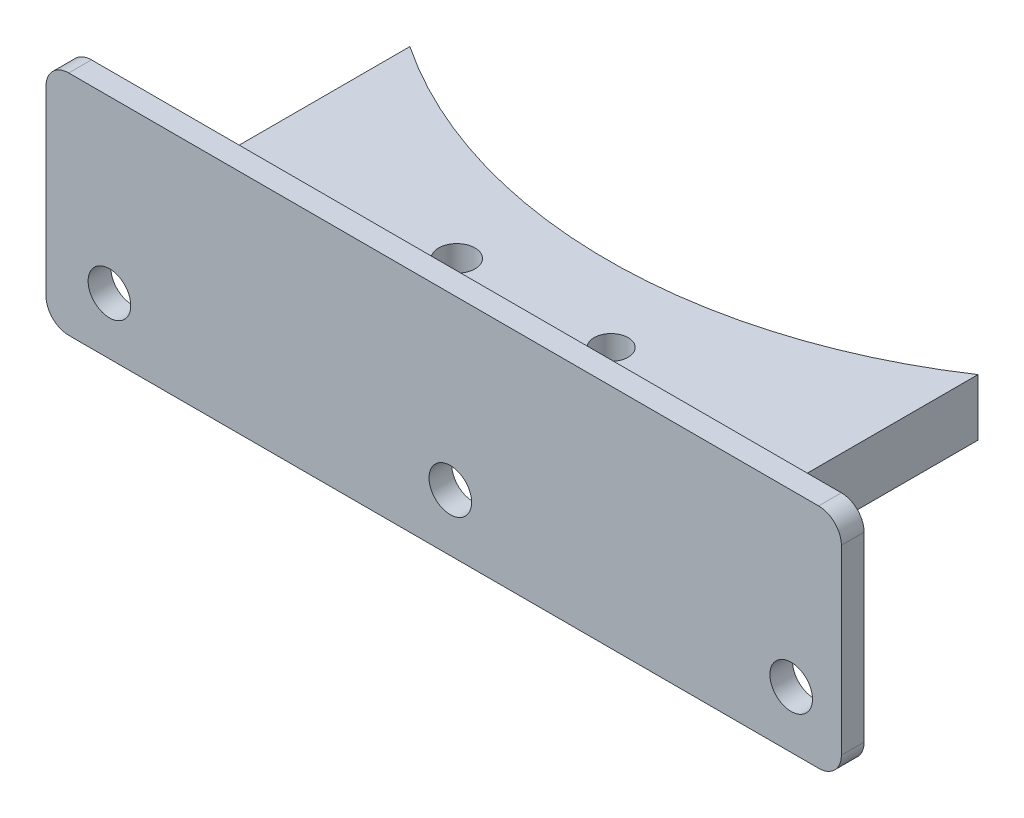
ISO-10303-21;
HEADER;
FILE_DESCRIPTION(('STEP AP214'),'2;1');
FILE_NAME('part.step','',(''),(''),'','','');
FILE_SCHEMA(('AUTOMOTIVE_DESIGN { 1 0 10303 214 1 1 1 1 }'));
ENDSEC;
DATA;
#1=APPLICATION_CONTEXT('core data for automotive mechanical design processes');
#2=APPLICATION_PROTOCOL_DEFINITION('international standard','automotive_design',2000,#1);
#3=PRODUCT_CONTEXT('',#1,'mechanical');
#4=PRODUCT('Part','Part','',(#3));
#5=PRODUCT_RELATED_PRODUCT_CATEGORY('part','',(#4));
#6=PRODUCT_DEFINITION_FORMATION('','',#4);
#7=PRODUCT_DEFINITION_CONTEXT('part definition',#1,'design');
#8=PRODUCT_DEFINITION('design','',#6,#7);
#9=PRODUCT_DEFINITION_SHAPE('','',#8);
#10=(LENGTH_UNIT() NAMED_UNIT(*) SI_UNIT(.MILLI.,.METRE.));
#11=(NAMED_UNIT(*) PLANE_ANGLE_UNIT() SI_UNIT($,.RADIAN.));
#12=(NAMED_UNIT(*) SI_UNIT($,.STERADIAN.) SOLID_ANGLE_UNIT());
#13=UNCERTAINTY_MEASURE_WITH_UNIT(LENGTH_MEASURE(1.E-05),#10,'distance_accuracy_value','');
#14=(GEOMETRIC_REPRESENTATION_CONTEXT(3) GLOBAL_UNCERTAINTY_ASSIGNED_CONTEXT((#13)) GLOBAL_UNIT_ASSIGNED_CONTEXT((#10,
#11,#12)) REPRESENTATION_CONTEXT('',''));
#15=CARTESIAN_POINT('',(0.,0.,0.));
#16=DIRECTION('',(0.,0.,1.));
#17=DIRECTION('',(1.,0.,0.));
#18=AXIS2_PLACEMENT_3D('',#15,#16,#17);
#19=CARTESIAN_POINT('',(0.,0.,0.));
#20=DIRECTION('',(0.,0.,-1.));
#21=DIRECTION('',(-1.,0.,0.));
#22=AXIS2_PLACEMENT_3D('',#19,#20,#21);
#23=PLANE('',#22);
#24=CARTESIAN_POINT('',(38.8383997376137,-6.35,0.));
#25=DIRECTION('',(0.,0.,-1.));
#26=DIRECTION('',(-1.,0.,0.));
#27=AXIS2_PLACEMENT_3D('',#24,#25,#26);
#28=CIRCLE('',#27,2.38125);
#29=CARTESIAN_POINT('',(36.4571497376137,-6.35,0.));
#30=VERTEX_POINT('',#29);
#31=EDGE_CURVE('E451',#30,#30,#28,.T.);
#32=ORIENTED_EDGE('',*,*,#31,.F.);
#33=EDGE_LOOP('',(#32));
#34=FACE_BOUND('',#33,.T.);
#35=CARTESIAN_POINT('',(0.738399737613658,-6.35,0.));
#36=DIRECTION('',(0.,0.,-1.));
#37=DIRECTION('',(-1.,0.,0.));
#38=AXIS2_PLACEMENT_3D('',#35,#36,#37);
#39=CIRCLE('',#38,2.38125);
#40=CARTESIAN_POINT('',(-1.64285026238634,-6.35,0.));
#41=VERTEX_POINT('',#40);
#42=EDGE_CURVE('E312',#41,#41,#39,.T.);
#43=ORIENTED_EDGE('',*,*,#42,.F.);
#44=EDGE_LOOP('',(#43));
#45=FACE_BOUND('',#44,.T.);
#46=CARTESIAN_POINT('',(-37.3616002623863,-6.35,0.));
#47=DIRECTION('',(0.,0.,-1.));
#48=DIRECTION('',(-1.,0.,0.));
#49=AXIS2_PLACEMENT_3D('',#46,#47,#48);
#50=CIRCLE('',#49,2.38125);
#51=CARTESIAN_POINT('',(-39.7428502623863,-6.35,0.));
#52=VERTEX_POINT('',#51);
#53=EDGE_CURVE('E300',#52,#52,#50,.T.);
#54=ORIENTED_EDGE('',*,*,#53,.F.);
#55=EDGE_LOOP('',(#54));
#56=FACE_BOUND('',#55,.T.);
#57=DIRECTION('',(0.,1.,0.));
#58=VECTOR('',#57,1.);
#59=CARTESIAN_POINT('',(44.45,-12.7,0.));
#60=LINE('',#59,#58);
#61=CARTESIAN_POINT('',(44.45,-10.16,0.));
#62=VERTEX_POINT('',#61);
#63=CARTESIAN_POINT('',(44.45,10.16,0.));
#64=VERTEX_POINT('',#63);
#65=EDGE_CURVE('E167',#62,#64,#60,.T.);
#66=ORIENTED_EDGE('',*,*,#65,.F.);
#67=CARTESIAN_POINT('',(41.91,-10.16,0.));
#68=DIRECTION('',(0.,0.,-1.));
#69=DIRECTION('',(-1.,0.,0.));
#70=AXIS2_PLACEMENT_3D('',#67,#68,#69);
#71=CIRCLE('',#70,2.54);
#72=CARTESIAN_POINT('',(41.91,-12.7,0.));
#73=VERTEX_POINT('',#72);
#74=EDGE_CURVE('E234',#62,#73,#71,.T.);
#75=ORIENTED_EDGE('',*,*,#74,.T.);
#76=DIRECTION('',(1.,0.,0.));
#77=VECTOR('',#76,1.);
#78=CARTESIAN_POINT('',(-44.45,-12.7,0.));
#79=LINE('',#78,#77);
#80=CARTESIAN_POINT('',(-41.91,-12.7,0.));
#81=VERTEX_POINT('',#80);
#82=EDGE_CURVE('E199',#81,#73,#79,.T.);
#83=ORIENTED_EDGE('',*,*,#82,.F.);
#84=CARTESIAN_POINT('',(-41.91,-10.16,0.));
#85=DIRECTION('',(0.,0.,-1.));
#86=DIRECTION('',(-1.,0.,0.));
#87=AXIS2_PLACEMENT_3D('',#84,#85,#86);
#88=CIRCLE('',#87,2.54);
#89=CARTESIAN_POINT('',(-44.45,-10.16,0.));
#90=VERTEX_POINT('',#89);
#91=EDGE_CURVE('E225',#81,#90,#88,.T.);
#92=ORIENTED_EDGE('',*,*,#91,.T.);
#93=DIRECTION('',(0.,-1.,0.));
#94=VECTOR('',#93,1.);
#95=CARTESIAN_POINT('',(-44.45,-12.7,0.));
#96=LINE('',#95,#94);
#97=CARTESIAN_POINT('',(-44.45,10.16,0.));
#98=VERTEX_POINT('',#97);
#99=EDGE_CURVE('E217',#98,#90,#96,.T.);
#100=ORIENTED_EDGE('',*,*,#99,.F.);
#101=CARTESIAN_POINT('',(-41.91,10.16,0.));
#102=DIRECTION('',(0.,0.,-1.));
#103=DIRECTION('',(-1.,0.,0.));
#104=AXIS2_PLACEMENT_3D('',#101,#102,#103);
#105=CIRCLE('',#104,2.54);
#106=CARTESIAN_POINT('',(-41.91,12.7,0.));
#107=VERTEX_POINT('',#106);
#108=EDGE_CURVE('E228',#98,#107,#105,.T.);
#109=ORIENTED_EDGE('',*,*,#108,.T.);
#110=DIRECTION('',(-1.,0.,0.));
#111=VECTOR('',#110,1.);
#112=CARTESIAN_POINT('',(-44.45,12.7,0.));
#113=LINE('',#112,#111);
#114=CARTESIAN_POINT('',(41.91,12.7,0.));
#115=VERTEX_POINT('',#114);
#116=EDGE_CURVE('E213',#115,#107,#113,.T.);
#117=ORIENTED_EDGE('',*,*,#116,.F.);
#118=CARTESIAN_POINT('',(41.91,10.16,0.));
#119=DIRECTION('',(0.,0.,-1.));
#120=DIRECTION('',(-1.,0.,0.));
#121=AXIS2_PLACEMENT_3D('',#118,#119,#120);
#122=CIRCLE('',#121,2.54);
#123=EDGE_CURVE('E231',#115,#64,#122,.T.);
#124=ORIENTED_EDGE('',*,*,#123,.T.);
#125=EDGE_LOOP('',(#66,#75,#83,#92,#100,#109,#117,#124));
#126=FACE_BOUND('',#125,.T.);
#127=DIRECTION('',(0.,-1.,0.));
#128=VECTOR('',#127,1.);
#129=CARTESIAN_POINT('',(-34.29,0.,0.));
#130=LINE('',#129,#128);
#131=CARTESIAN_POINT('',(-34.29,8.89,0.));
#132=VERTEX_POINT('',#131);
#133=CARTESIAN_POINT('',(-34.29,0.,0.));
#134=VERTEX_POINT('',#133);
#135=EDGE_CURVE('E240',#132,#134,#130,.T.);
#136=ORIENTED_EDGE('',*,*,#135,.T.);
#137=DIRECTION('',(1.,0.,0.));
#138=VECTOR('',#137,1.);
#139=CARTESIAN_POINT('',(-31.75,0.,0.));
#140=LINE('',#139,#138);
#141=CARTESIAN_POINT('',(34.29,0.,0.));
#142=VERTEX_POINT('',#141);
#143=EDGE_CURVE('E157',#134,#142,#140,.T.);
#144=ORIENTED_EDGE('',*,*,#143,.T.);
#145=DIRECTION('',(0.,-1.,0.));
#146=VECTOR('',#145,1.);
#147=CARTESIAN_POINT('',(34.29,0.,0.));
#148=LINE('',#147,#146);
#149=CARTESIAN_POINT('',(34.29,8.89,0.));
#150=VERTEX_POINT('',#149);
#151=EDGE_CURVE('E244',#142,#150,#148,.F.);
#152=ORIENTED_EDGE('',*,*,#151,.T.);
#153=DIRECTION('',(1.,0.,0.));
#154=VECTOR('',#153,1.);
#155=CARTESIAN_POINT('',(-31.75,8.89,0.));
#156=LINE('',#155,#154);
#157=EDGE_CURVE('E237',#150,#132,#156,.F.);
#158=ORIENTED_EDGE('',*,*,#157,.T.);
#159=EDGE_LOOP('',(#136,#144,#152,#158));
#160=FACE_BOUND('',#159,.T.);
#161=ADVANCED_FACE('F39',(#34,#45,#56,#126,#160),#23,.T.);
#162=CARTESIAN_POINT('',(44.45,-12.7,2.54));
#163=DIRECTION('',(-1.,0.,0.));
#164=DIRECTION('',(0.,0.,1.));
#165=AXIS2_PLACEMENT_3D('',#162,#163,#164);
#166=PLANE('',#165);
#167=DIRECTION('',(0.,1.,0.));
#168=VECTOR('',#167,1.);
#169=CARTESIAN_POINT('',(44.45,-12.7,2.54));
#170=LINE('',#169,#168);
#171=CARTESIAN_POINT('',(44.45,-10.16,2.54));
#172=VERTEX_POINT('',#171);
#173=CARTESIAN_POINT('',(44.45,10.16,2.54));
#174=VERTEX_POINT('',#173);
#175=EDGE_CURVE('E194',#172,#174,#170,.T.);
#176=ORIENTED_EDGE('',*,*,#175,.F.);
#177=DIRECTION('',(0.,0.,-1.));
#178=VECTOR('',#177,1.);
#179=CARTESIAN_POINT('',(44.45,-10.16,2.54));
#180=LINE('',#179,#178);
#181=EDGE_CURVE('E255',#172,#62,#180,.T.);
#182=ORIENTED_EDGE('',*,*,#181,.T.);
#183=ORIENTED_EDGE('',*,*,#65,.T.);
#184=DIRECTION('',(0.,0.,-1.));
#185=VECTOR('',#184,1.);
#186=CARTESIAN_POINT('',(44.45,10.16,2.54));
#187=LINE('',#186,#185);
#188=EDGE_CURVE('E252',#64,#174,#187,.F.);
#189=ORIENTED_EDGE('',*,*,#188,.T.);
#190=EDGE_LOOP('',(#176,#182,#183,#189));
#191=FACE_BOUND('',#190,.T.);
#192=ADVANCED_FACE('F352',(#191),#166,.F.);
#193=CARTESIAN_POINT('',(-44.45,12.7,2.54));
#194=DIRECTION('',(0.,-1.,0.));
#195=DIRECTION('',(0.,0.,-1.));
#196=AXIS2_PLACEMENT_3D('',#193,#194,#195);
#197=PLANE('',#196);
#198=DIRECTION('',(-1.,0.,0.));
#199=VECTOR('',#198,1.);
#200=CARTESIAN_POINT('',(-44.45,12.7,2.54));
#201=LINE('',#200,#199);
#202=CARTESIAN_POINT('',(41.91,12.7,2.54));
#203=VERTEX_POINT('',#202);
#204=CARTESIAN_POINT('',(-41.91,12.7,2.54));
#205=VERTEX_POINT('',#204);
#206=EDGE_CURVE('E198',#203,#205,#201,.T.);
#207=ORIENTED_EDGE('',*,*,#206,.F.);
#208=DIRECTION('',(0.,0.,-1.));
#209=VECTOR('',#208,1.);
#210=CARTESIAN_POINT('',(41.91,12.7,2.54));
#211=LINE('',#210,#209);
#212=EDGE_CURVE('E280',#203,#115,#211,.T.);
#213=ORIENTED_EDGE('',*,*,#212,.T.);
#214=ORIENTED_EDGE('',*,*,#116,.T.);
#215=DIRECTION('',(0.,0.,-1.));
#216=VECTOR('',#215,1.);
#217=CARTESIAN_POINT('',(-41.91,12.7,2.54));
#218=LINE('',#217,#216);
#219=EDGE_CURVE('E277',#107,#205,#218,.F.);
#220=ORIENTED_EDGE('',*,*,#219,.T.);
#221=EDGE_LOOP('',(#207,#213,#214,#220));
#222=FACE_BOUND('',#221,.T.);
#223=ADVANCED_FACE('F358',(#222),#197,.F.);
#224=CARTESIAN_POINT('',(-44.45,-12.7,2.54));
#225=DIRECTION('',(1.,0.,0.));
#226=DIRECTION('',(0.,0.,-1.));
#227=AXIS2_PLACEMENT_3D('',#224,#225,#226);
#228=PLANE('',#227);
#229=DIRECTION('',(0.,-1.,0.));
#230=VECTOR('',#229,1.);
#231=CARTESIAN_POINT('',(-44.45,-12.7,2.54));
#232=LINE('',#231,#230);
#233=CARTESIAN_POINT('',(-44.45,10.16,2.54));
#234=VERTEX_POINT('',#233);
#235=CARTESIAN_POINT('',(-44.45,-10.16,2.54));
#236=VERTEX_POINT('',#235);
#237=EDGE_CURVE('E202',#234,#236,#232,.T.);
#238=ORIENTED_EDGE('',*,*,#237,.F.);
#239=DIRECTION('',(0.,0.,-1.));
#240=VECTOR('',#239,1.);
#241=CARTESIAN_POINT('',(-44.45,10.16,2.54));
#242=LINE('',#241,#240);
#243=EDGE_CURVE('E286',#234,#98,#242,.T.);
#244=ORIENTED_EDGE('',*,*,#243,.T.);
#245=ORIENTED_EDGE('',*,*,#99,.T.);
#246=DIRECTION('',(0.,0.,-1.));
#247=VECTOR('',#246,1.);
#248=CARTESIAN_POINT('',(-44.45,-10.16,2.54));
#249=LINE('',#248,#247);
#250=EDGE_CURVE('E57',#90,#236,#249,.F.);
#251=ORIENTED_EDGE('',*,*,#250,.T.);
#252=EDGE_LOOP('',(#238,#244,#245,#251));
#253=FACE_BOUND('',#252,.T.);
#254=ADVANCED_FACE('F370',(#253),#228,.F.);
#255=CARTESIAN_POINT('',(-44.45,-12.7,2.54));
#256=DIRECTION('',(0.,1.,0.));
#257=DIRECTION('',(0.,0.,1.));
#258=AXIS2_PLACEMENT_3D('',#255,#256,#257);
#259=PLANE('',#258);
#260=ORIENTED_EDGE('',*,*,#82,.T.);
#261=DIRECTION('',(0.,0.,-1.));
#262=VECTOR('',#261,1.);
#263=CARTESIAN_POINT('',(41.91,-12.7,2.54));
#264=LINE('',#263,#262);
#265=CARTESIAN_POINT('',(41.91,-12.7,2.54));
#266=VERTEX_POINT('',#265);
#267=EDGE_CURVE('E263',#73,#266,#264,.F.);
#268=ORIENTED_EDGE('',*,*,#267,.T.);
#269=DIRECTION('',(1.,0.,0.));
#270=VECTOR('',#269,1.);
#271=CARTESIAN_POINT('',(-44.45,-12.7,2.54));
#272=LINE('',#271,#270);
#273=CARTESIAN_POINT('',(-41.91,-12.7,2.54));
#274=VERTEX_POINT('',#273);
#275=EDGE_CURVE('E205',#274,#266,#272,.T.);
#276=ORIENTED_EDGE('',*,*,#275,.F.);
#277=DIRECTION('',(0.,0.,-1.));
#278=VECTOR('',#277,1.);
#279=CARTESIAN_POINT('',(-41.91,-12.7,2.54));
#280=LINE('',#279,#278);
#281=EDGE_CURVE('E259',#274,#81,#280,.T.);
#282=ORIENTED_EDGE('',*,*,#281,.T.);
#283=EDGE_LOOP('',(#260,#268,#276,#282));
#284=FACE_BOUND('',#283,.T.);
#285=ADVANCED_FACE('F367',(#284),#259,.F.);
#286=CARTESIAN_POINT('',(0.,0.,2.54));
#287=DIRECTION('',(0.,0.,-1.));
#288=DIRECTION('',(-1.,0.,0.));
#289=AXIS2_PLACEMENT_3D('',#286,#287,#288);
#290=PLANE('',#289);
#291=CARTESIAN_POINT('',(38.8383997376137,-6.35,2.54));
#292=DIRECTION('',(0.,0.,-1.));
#293=DIRECTION('',(-1.,0.,0.));
#294=AXIS2_PLACEMENT_3D('',#291,#292,#293);
#295=CIRCLE('',#294,2.38125);
#296=CARTESIAN_POINT('',(36.4571497376137,-6.35,2.54));
#297=VERTEX_POINT('',#296);
#298=EDGE_CURVE('E325',#297,#297,#295,.T.);
#299=ORIENTED_EDGE('',*,*,#298,.T.);
#300=EDGE_LOOP('',(#299));
#301=FACE_BOUND('',#300,.T.);
#302=CARTESIAN_POINT('',(0.738399737613658,-6.35,2.54));
#303=DIRECTION('',(0.,0.,-1.));
#304=DIRECTION('',(-1.,0.,0.));
#305=AXIS2_PLACEMENT_3D('',#302,#303,#304);
#306=CIRCLE('',#305,2.38125);
#307=CARTESIAN_POINT('',(-1.64285026238634,-6.35,2.54));
#308=VERTEX_POINT('',#307);
#309=EDGE_CURVE('E433',#308,#308,#306,.T.);
#310=ORIENTED_EDGE('',*,*,#309,.T.);
#311=EDGE_LOOP('',(#310));
#312=FACE_BOUND('',#311,.T.);
#313=CARTESIAN_POINT('',(-37.3616002623863,-6.35,2.54));
#314=DIRECTION('',(0.,0.,-1.));
#315=DIRECTION('',(-1.,0.,0.));
#316=AXIS2_PLACEMENT_3D('',#313,#314,#315);
#317=CIRCLE('',#316,2.38125);
#318=CARTESIAN_POINT('',(-39.7428502623863,-6.35,2.54));
#319=VERTEX_POINT('',#318);
#320=EDGE_CURVE('E306',#319,#319,#317,.T.);
#321=ORIENTED_EDGE('',*,*,#320,.T.);
#322=EDGE_LOOP('',(#321));
#323=FACE_BOUND('',#322,.T.);
#324=ORIENTED_EDGE('',*,*,#275,.T.);
#325=CARTESIAN_POINT('',(41.91,-10.16,2.54));
#326=DIRECTION('',(0.,0.,-1.));
#327=DIRECTION('',(-1.,0.,0.));
#328=AXIS2_PLACEMENT_3D('',#325,#326,#327);
#329=CIRCLE('',#328,2.54);
#330=EDGE_CURVE('E274',#266,#172,#329,.F.);
#331=ORIENTED_EDGE('',*,*,#330,.T.);
#332=ORIENTED_EDGE('',*,*,#175,.T.);
#333=CARTESIAN_POINT('',(41.91,10.16,2.54));
#334=DIRECTION('',(0.,0.,-1.));
#335=DIRECTION('',(-1.,0.,0.));
#336=AXIS2_PLACEMENT_3D('',#333,#334,#335);
#337=CIRCLE('',#336,2.54);
#338=EDGE_CURVE('E271',#174,#203,#337,.F.);
#339=ORIENTED_EDGE('',*,*,#338,.T.);
#340=ORIENTED_EDGE('',*,*,#206,.T.);
#341=CARTESIAN_POINT('',(-41.91,10.16,2.54));
#342=DIRECTION('',(0.,0.,-1.));
#343=DIRECTION('',(-1.,0.,0.));
#344=AXIS2_PLACEMENT_3D('',#341,#342,#343);
#345=CIRCLE('',#344,2.54);
#346=EDGE_CURVE('E64',#205,#234,#345,.F.);
#347=ORIENTED_EDGE('',*,*,#346,.T.);
#348=ORIENTED_EDGE('',*,*,#237,.T.);
#349=CARTESIAN_POINT('',(-41.91,-10.16,2.54));
#350=DIRECTION('',(0.,0.,-1.));
#351=DIRECTION('',(-1.,0.,0.));
#352=AXIS2_PLACEMENT_3D('',#349,#350,#351);
#353=CIRCLE('',#352,2.54);
#354=EDGE_CURVE('E266',#236,#274,#353,.F.);
#355=ORIENTED_EDGE('',*,*,#354,.T.);
#356=EDGE_LOOP('',(#324,#331,#332,#339,#340,#347,#348,#355));
#357=FACE_BOUND('',#356,.T.);
#358=ADVANCED_FACE('F365',(#301,#312,#323,#357),#290,.F.);
#359=CARTESIAN_POINT('',(0.,6.35,-73.025));
#360=DIRECTION('',(0.,1.,0.));
#361=DIRECTION('',(0.,0.,1.));
#362=AXIS2_PLACEMENT_3D('',#359,#360,#361);
#363=PLANE('',#362);
#364=CARTESIAN_POINT('',(-8.61994973421176,6.35,-7.54998135487348));
#365=DIRECTION('',(0.,1.,0.));
#366=DIRECTION('',(0.,0.,1.));
#367=AXIS2_PLACEMENT_3D('',#364,#365,#366);
#368=CIRCLE('',#367,2.032);
#369=CARTESIAN_POINT('',(-8.61994973421176,6.35,-5.51798135487347));
#370=VERTEX_POINT('',#369);
#371=EDGE_CURVE('E183',#370,#370,#368,.T.);
#372=ORIENTED_EDGE('',*,*,#371,.F.);
#373=EDGE_LOOP('',(#372));
#374=FACE_BOUND('',#373,.T.);
#375=DIRECTION('',(0.,0.,1.));
#376=VECTOR('',#375,1.);
#377=CARTESIAN_POINT('',(-31.75,6.35,0.));
#378=LINE('',#377,#376);
#379=CARTESIAN_POINT('',(-31.75,6.35,-25.4296001986536));
#380=VERTEX_POINT('',#379);
#381=CARTESIAN_POINT('',(-31.75,6.35,-2.54));
#382=VERTEX_POINT('',#381);
#383=EDGE_CURVE('E174',#380,#382,#378,.T.);
#384=ORIENTED_EDGE('',*,*,#383,.T.);
#385=DIRECTION('',(1.,0.,0.));
#386=VECTOR('',#385,1.);
#387=CARTESIAN_POINT('',(31.75,6.35,-2.54));
#388=LINE('',#387,#386);
#389=CARTESIAN_POINT('',(31.75,6.35,-2.54));
#390=VERTEX_POINT('',#389);
#391=EDGE_CURVE('E152',#382,#390,#388,.T.);
#392=ORIENTED_EDGE('',*,*,#391,.T.);
#393=DIRECTION('',(0.,0.,-1.));
#394=VECTOR('',#393,1.);
#395=CARTESIAN_POINT('',(31.75,6.35,0.));
#396=LINE('',#395,#394);
#397=CARTESIAN_POINT('',(31.75,6.35,-25.4296001986536));
#398=VERTEX_POINT('',#397);
#399=EDGE_CURVE('E143',#390,#398,#396,.T.);
#400=ORIENTED_EDGE('',*,*,#399,.T.);
#401=CARTESIAN_POINT('',(0.,6.35,-73.025));
#402=DIRECTION('',(0.,-1.,0.));
#403=DIRECTION('',(0.,0.,1.));
#404=AXIS2_PLACEMENT_3D('',#401,#402,#403);
#405=CIRCLE('',#404,57.2135);
#406=EDGE_CURVE('E149',#398,#380,#405,.T.);
#407=ORIENTED_EDGE('',*,*,#406,.T.);
#408=EDGE_LOOP('',(#384,#392,#400,#407));
#409=FACE_BOUND('',#408,.T.);
#410=CARTESIAN_POINT('',(8.61994973421177,6.35,-7.54998135487349));
#411=DIRECTION('',(0.,1.,0.));
#412=DIRECTION('',(0.,0.,1.));
#413=AXIS2_PLACEMENT_3D('',#410,#411,#412);
#414=CIRCLE('',#413,1.905);
#415=CARTESIAN_POINT('',(8.61994973421177,6.35,-5.64498135487349));
#416=VERTEX_POINT('',#415);
#417=EDGE_CURVE('E316',#416,#416,#414,.T.);
#418=ORIENTED_EDGE('',*,*,#417,.F.);
#419=EDGE_LOOP('',(#418));
#420=FACE_BOUND('',#419,.T.);
#421=ADVANCED_FACE('F146',(#374,#409,#420),#363,.T.);
#422=CARTESIAN_POINT('',(0.,0.,-73.025));
#423=DIRECTION('',(0.,1.,0.));
#424=DIRECTION('',(0.,0.,1.));
#425=AXIS2_PLACEMENT_3D('',#422,#423,#424);
#426=PLANE('',#425);
#427=DIRECTION('',(0.,0.,-1.));
#428=VECTOR('',#427,1.);
#429=CARTESIAN_POINT('',(31.75,0.,0.));
#430=LINE('',#429,#428);
#431=CARTESIAN_POINT('',(31.75,0.,-2.54));
#432=VERTEX_POINT('',#431);
#433=CARTESIAN_POINT('',(31.75,0.,-25.4296001986536));
#434=VERTEX_POINT('',#433);
#435=EDGE_CURVE('E163',#432,#434,#430,.T.);
#436=ORIENTED_EDGE('',*,*,#435,.F.);
#437=CARTESIAN_POINT('',(34.29,0.,-2.54));
#438=DIRECTION('',(0.,1.,0.));
#439=DIRECTION('',(0.,0.,1.));
#440=AXIS2_PLACEMENT_3D('',#437,#438,#439);
#441=CIRCLE('',#440,2.54);
#442=EDGE_CURVE('E49',#432,#142,#441,.T.);
#443=ORIENTED_EDGE('',*,*,#442,.T.);
#444=ORIENTED_EDGE('',*,*,#143,.F.);
#445=CARTESIAN_POINT('',(-34.29,0.,-2.54));
#446=DIRECTION('',(0.,1.,0.));
#447=DIRECTION('',(0.,0.,1.));
#448=AXIS2_PLACEMENT_3D('',#445,#446,#447);
#449=CIRCLE('',#448,2.54);
#450=CARTESIAN_POINT('',(-31.75,0.,-2.54));
#451=VERTEX_POINT('',#450);
#452=EDGE_CURVE('E11',#134,#451,#449,.T.);
#453=ORIENTED_EDGE('',*,*,#452,.T.);
#454=DIRECTION('',(0.,0.,1.));
#455=VECTOR('',#454,1.);
#456=CARTESIAN_POINT('',(-31.75,0.,0.));
#457=LINE('',#456,#455);
#458=CARTESIAN_POINT('',(-31.75,0.,-25.4296001986536));
#459=VERTEX_POINT('',#458);
#460=EDGE_CURVE('E186',#459,#451,#457,.T.);
#461=ORIENTED_EDGE('',*,*,#460,.F.);
#462=CARTESIAN_POINT('',(0.,0.,-73.025));
#463=DIRECTION('',(0.,-1.,0.));
#464=DIRECTION('',(0.,0.,1.));
#465=AXIS2_PLACEMENT_3D('',#462,#463,#464);
#466=CIRCLE('',#465,57.2135);
#467=EDGE_CURVE('E182',#434,#459,#466,.T.);
#468=ORIENTED_EDGE('',*,*,#467,.F.);
#469=EDGE_LOOP('',(#436,#443,#444,#453,#461,#468));
#470=FACE_BOUND('',#469,.T.);
#471=CARTESIAN_POINT('',(-8.61994973421176,0.,-7.54998135487348));
#472=DIRECTION('',(0.,1.,0.));
#473=DIRECTION('',(0.,0.,1.));
#474=AXIS2_PLACEMENT_3D('',#471,#472,#473);
#475=CIRCLE('',#474,2.032);
#476=CARTESIAN_POINT('',(-8.61994973421176,0.,-5.51798135487347));
#477=VERTEX_POINT('',#476);
#478=EDGE_CURVE('E320',#477,#477,#475,.T.);
#479=ORIENTED_EDGE('',*,*,#478,.T.);
#480=EDGE_LOOP('',(#479));
#481=FACE_BOUND('',#480,.T.);
#482=CARTESIAN_POINT('',(8.61994973421177,0.,-7.54998135487349));
#483=DIRECTION('',(0.,1.,0.));
#484=DIRECTION('',(0.,0.,1.));
#485=AXIS2_PLACEMENT_3D('',#482,#483,#484);
#486=CIRCLE('',#485,1.905);
#487=CARTESIAN_POINT('',(8.61994973421177,0.,-5.64498135487349));
#488=VERTEX_POINT('',#487);
#489=EDGE_CURVE('E321',#488,#488,#486,.T.);
#490=ORIENTED_EDGE('',*,*,#489,.T.);
#491=EDGE_LOOP('',(#490));
#492=FACE_BOUND('',#491,.T.);
#493=ADVANCED_FACE('F332',(#470,#481,#492),#426,.F.);
#494=CARTESIAN_POINT('',(31.75,6.35,0.));
#495=DIRECTION('',(-1.,0.,0.));
#496=DIRECTION('',(0.,0.,1.));
#497=AXIS2_PLACEMENT_3D('',#494,#495,#496);
#498=PLANE('',#497);
#499=ORIENTED_EDGE('',*,*,#399,.F.);
#500=DIRECTION('',(0.,-1.,0.));
#501=VECTOR('',#500,1.);
#502=CARTESIAN_POINT('',(31.75,6.35,-2.54));
#503=LINE('',#502,#501);
#504=EDGE_CURVE('E209',#390,#432,#503,.T.);
#505=ORIENTED_EDGE('',*,*,#504,.T.);
#506=ORIENTED_EDGE('',*,*,#435,.T.);
#507=DIRECTION('',(0.,-1.,0.));
#508=VECTOR('',#507,1.);
#509=CARTESIAN_POINT('',(31.75,6.35,-25.4296001986536));
#510=LINE('',#509,#508);
#511=EDGE_CURVE('E160',#398,#434,#510,.T.);
#512=ORIENTED_EDGE('',*,*,#511,.F.);
#513=EDGE_LOOP('',(#499,#505,#506,#512));
#514=FACE_BOUND('',#513,.T.);
#515=ADVANCED_FACE('F161',(#514),#498,.F.);
#516=CARTESIAN_POINT('',(0.,6.35,-73.025));
#517=DIRECTION('',(0.,-1.,0.));
#518=DIRECTION('',(0.,0.,-1.));
#519=AXIS2_PLACEMENT_3D('',#516,#517,#518);
#520=CYLINDRICAL_SURFACE('',#519,57.2135);
#521=ORIENTED_EDGE('',*,*,#467,.T.);
#522=DIRECTION('',(0.,-1.,0.));
#523=VECTOR('',#522,1.);
#524=CARTESIAN_POINT('',(-31.75,6.35,-25.4296001986536));
#525=LINE('',#524,#523);
#526=EDGE_CURVE('E168',#380,#459,#525,.T.);
#527=ORIENTED_EDGE('',*,*,#526,.F.);
#528=ORIENTED_EDGE('',*,*,#406,.F.);
#529=ORIENTED_EDGE('',*,*,#511,.T.);
#530=EDGE_LOOP('',(#521,#527,#528,#529));
#531=FACE_BOUND('',#530,.T.);
#532=ADVANCED_FACE('F170',(#531),#520,.F.);
#533=CARTESIAN_POINT('',(-31.75,6.35,0.));
#534=DIRECTION('',(1.,0.,0.));
#535=DIRECTION('',(0.,0.,-1.));
#536=AXIS2_PLACEMENT_3D('',#533,#534,#535);
#537=PLANE('',#536);
#538=ORIENTED_EDGE('',*,*,#460,.T.);
#539=DIRECTION('',(0.,-1.,0.));
#540=VECTOR('',#539,1.);
#541=CARTESIAN_POINT('',(-31.75,6.35,-2.54));
#542=LINE('',#541,#540);
#543=EDGE_CURVE('E247',#451,#382,#542,.F.);
#544=ORIENTED_EDGE('',*,*,#543,.T.);
#545=ORIENTED_EDGE('',*,*,#383,.F.);
#546=ORIENTED_EDGE('',*,*,#526,.T.);
#547=EDGE_LOOP('',(#538,#544,#545,#546));
#548=FACE_BOUND('',#547,.T.);
#549=ADVANCED_FACE('F338',(#548),#537,.F.);
#550=CARTESIAN_POINT('',(-8.61994973421176,6.35,-7.54998135487348));
#551=DIRECTION('',(0.,-1.,0.));
#552=DIRECTION('',(0.,0.,-1.));
#553=AXIS2_PLACEMENT_3D('',#550,#551,#552);
#554=CYLINDRICAL_SURFACE('',#553,2.032);
#555=ORIENTED_EDGE('',*,*,#371,.T.);
#556=EDGE_LOOP('',(#555));
#557=FACE_BOUND('',#556,.T.);
#558=ORIENTED_EDGE('',*,*,#478,.F.);
#559=EDGE_LOOP('',(#558));
#560=FACE_BOUND('',#559,.T.);
#561=ADVANCED_FACE('F335',(#557,#560),#554,.F.);
#562=CARTESIAN_POINT('',(8.61994973421177,6.35,-7.54998135487349));
#563=DIRECTION('',(0.,-1.,0.));
#564=DIRECTION('',(0.,0.,-1.));
#565=AXIS2_PLACEMENT_3D('',#562,#563,#564);
#566=CYLINDRICAL_SURFACE('',#565,1.905);
#567=ORIENTED_EDGE('',*,*,#417,.T.);
#568=EDGE_LOOP('',(#567));
#569=FACE_BOUND('',#568,.T.);
#570=ORIENTED_EDGE('',*,*,#489,.F.);
#571=EDGE_LOOP('',(#570));
#572=FACE_BOUND('',#571,.T.);
#573=ADVANCED_FACE('F337',(#569,#572),#566,.F.);
#574=CARTESIAN_POINT('',(-37.3616002623863,-6.35,2.54));
#575=DIRECTION('',(0.,0.,-1.));
#576=DIRECTION('',(-1.,0.,0.));
#577=AXIS2_PLACEMENT_3D('',#574,#575,#576);
#578=CYLINDRICAL_SURFACE('',#577,2.38125);
#579=ORIENTED_EDGE('',*,*,#320,.F.);
#580=EDGE_LOOP('',(#579));
#581=FACE_BOUND('',#580,.T.);
#582=ORIENTED_EDGE('',*,*,#53,.T.);
#583=EDGE_LOOP('',(#582));
#584=FACE_BOUND('',#583,.T.);
#585=ADVANCED_FACE('F345',(#581,#584),#578,.F.);
#586=CARTESIAN_POINT('',(0.738399737613658,-6.35,2.54));
#587=DIRECTION('',(0.,0.,-1.));
#588=DIRECTION('',(-1.,0.,0.));
#589=AXIS2_PLACEMENT_3D('',#586,#587,#588);
#590=CYLINDRICAL_SURFACE('',#589,2.38125);
#591=ORIENTED_EDGE('',*,*,#309,.F.);
#592=EDGE_LOOP('',(#591));
#593=FACE_BOUND('',#592,.T.);
#594=ORIENTED_EDGE('',*,*,#42,.T.);
#595=EDGE_LOOP('',(#594));
#596=FACE_BOUND('',#595,.T.);
#597=ADVANCED_FACE('F437',(#593,#596),#590,.F.);
#598=CARTESIAN_POINT('',(38.8383997376137,-6.35,2.54));
#599=DIRECTION('',(0.,0.,-1.));
#600=DIRECTION('',(-1.,0.,0.));
#601=AXIS2_PLACEMENT_3D('',#598,#599,#600);
#602=CYLINDRICAL_SURFACE('',#601,2.38125);
#603=ORIENTED_EDGE('',*,*,#298,.F.);
#604=EDGE_LOOP('',(#603));
#605=FACE_BOUND('',#604,.T.);
#606=ORIENTED_EDGE('',*,*,#31,.T.);
#607=EDGE_LOOP('',(#606));
#608=FACE_BOUND('',#607,.T.);
#609=ADVANCED_FACE('F387',(#605,#608),#602,.F.);
#610=CARTESIAN_POINT('',(-34.29,0.,-2.54));
#611=DIRECTION('',(0.,-1.,0.));
#612=DIRECTION('',(0.,0.,-1.));
#613=AXIS2_PLACEMENT_3D('',#610,#611,#612);
#614=CYLINDRICAL_SURFACE('',#613,2.54);
#615=ORIENTED_EDGE('',*,*,#452,.F.);
#616=ORIENTED_EDGE('',*,*,#135,.F.);
#617=CARTESIAN_POINT('',(-34.29,8.89,-2.54));
#618=DIRECTION('',(-0.707106781186547,-0.707106781186547,0.));
#619=DIRECTION('',(-0.707106781186547,0.707106781186547,0.));
#620=AXIS2_PLACEMENT_3D('',#617,#618,#619);
#621=ELLIPSE('',#620,3.59210244842766,2.54);
#622=EDGE_CURVE('E43',#382,#132,#621,.T.);
#623=ORIENTED_EDGE('',*,*,#622,.F.);
#624=ORIENTED_EDGE('',*,*,#543,.F.);
#625=EDGE_LOOP('',(#615,#616,#623,#624));
#626=FACE_BOUND('',#625,.T.);
#627=ADVANCED_FACE('F384',(#626),#614,.F.);
#628=CARTESIAN_POINT('',(0.,8.89,-2.54));
#629=DIRECTION('',(-1.,0.,0.));
#630=DIRECTION('',(0.,0.,1.));
#631=AXIS2_PLACEMENT_3D('',#628,#629,#630);
#632=CYLINDRICAL_SURFACE('',#631,2.54);
#633=ORIENTED_EDGE('',*,*,#622,.T.);
#634=ORIENTED_EDGE('',*,*,#157,.F.);
#635=CARTESIAN_POINT('',(34.29,8.89,-2.54));
#636=DIRECTION('',(-0.707106781186547,0.707106781186547,0.));
#637=DIRECTION('',(-0.707106781186547,-0.707106781186547,0.));
#638=AXIS2_PLACEMENT_3D('',#635,#636,#637);
#639=ELLIPSE('',#638,3.59210244842766,2.54);
#640=EDGE_CURVE('E292',#390,#150,#639,.T.);
#641=ORIENTED_EDGE('',*,*,#640,.F.);
#642=ORIENTED_EDGE('',*,*,#391,.F.);
#643=EDGE_LOOP('',(#633,#634,#641,#642));
#644=FACE_BOUND('',#643,.T.);
#645=ADVANCED_FACE('F381',(#644),#632,.F.);
#646=CARTESIAN_POINT('',(34.29,6.35,-2.54));
#647=DIRECTION('',(0.,-1.,0.));
#648=DIRECTION('',(0.,0.,-1.));
#649=AXIS2_PLACEMENT_3D('',#646,#647,#648);
#650=CYLINDRICAL_SURFACE('',#649,2.54);
#651=ORIENTED_EDGE('',*,*,#640,.T.);
#652=ORIENTED_EDGE('',*,*,#151,.F.);
#653=ORIENTED_EDGE('',*,*,#442,.F.);
#654=ORIENTED_EDGE('',*,*,#504,.F.);
#655=EDGE_LOOP('',(#651,#652,#653,#654));
#656=FACE_BOUND('',#655,.T.);
#657=ADVANCED_FACE('F377',(#656),#650,.F.);
#658=CARTESIAN_POINT('',(41.91,-10.16,2.54));
#659=DIRECTION('',(0.,0.,-1.));
#660=DIRECTION('',(-1.,0.,0.));
#661=AXIS2_PLACEMENT_3D('',#658,#659,#660);
#662=CYLINDRICAL_SURFACE('',#661,2.54);
#663=ORIENTED_EDGE('',*,*,#330,.F.);
#664=ORIENTED_EDGE('',*,*,#267,.F.);
#665=ORIENTED_EDGE('',*,*,#74,.F.);
#666=ORIENTED_EDGE('',*,*,#181,.F.);
#667=EDGE_LOOP('',(#663,#664,#665,#666));
#668=FACE_BOUND('',#667,.T.);
#669=ADVANCED_FACE('F380',(#668),#662,.T.);
#670=CARTESIAN_POINT('',(41.91,10.16,2.54));
#671=DIRECTION('',(0.,0.,-1.));
#672=DIRECTION('',(-1.,0.,0.));
#673=AXIS2_PLACEMENT_3D('',#670,#671,#672);
#674=CYLINDRICAL_SURFACE('',#673,2.54);
#675=ORIENTED_EDGE('',*,*,#338,.F.);
#676=ORIENTED_EDGE('',*,*,#188,.F.);
#677=ORIENTED_EDGE('',*,*,#123,.F.);
#678=ORIENTED_EDGE('',*,*,#212,.F.);
#679=EDGE_LOOP('',(#675,#676,#677,#678));
#680=FACE_BOUND('',#679,.T.);
#681=ADVANCED_FACE('F391',(#680),#674,.T.);
#682=CARTESIAN_POINT('',(-41.91,10.16,2.54));
#683=DIRECTION('',(0.,0.,-1.));
#684=DIRECTION('',(-1.,0.,0.));
#685=AXIS2_PLACEMENT_3D('',#682,#683,#684);
#686=CYLINDRICAL_SURFACE('',#685,2.54);
#687=ORIENTED_EDGE('',*,*,#346,.F.);
#688=ORIENTED_EDGE('',*,*,#219,.F.);
#689=ORIENTED_EDGE('',*,*,#108,.F.);
#690=ORIENTED_EDGE('',*,*,#243,.F.);
#691=EDGE_LOOP('',(#687,#688,#689,#690));
#692=FACE_BOUND('',#691,.T.);
#693=ADVANCED_FACE('F394',(#692),#686,.T.);
#694=CARTESIAN_POINT('',(-41.91,-10.16,2.54));
#695=DIRECTION('',(0.,0.,-1.));
#696=DIRECTION('',(-1.,0.,0.));
#697=AXIS2_PLACEMENT_3D('',#694,#695,#696);
#698=CYLINDRICAL_SURFACE('',#697,2.54);
#699=ORIENTED_EDGE('',*,*,#354,.F.);
#700=ORIENTED_EDGE('',*,*,#250,.F.);
#701=ORIENTED_EDGE('',*,*,#91,.F.);
#702=ORIENTED_EDGE('',*,*,#281,.F.);
#703=EDGE_LOOP('',(#699,#700,#701,#702));
#704=FACE_BOUND('',#703,.T.);
#705=ADVANCED_FACE('F41',(#704),#698,.T.);
#706=CLOSED_SHELL('',(#161,#192,#223,#254,#285,#358,#421,#493,#515,#532,#549,#561,#573,#585,
#597,#609,#627,#645,#657,#669,#681,#693,#705));
#707=MANIFOLD_SOLID_BREP('B2',#706);
#708=ADVANCED_BREP_SHAPE_REPRESENTATION('',(#18,#707),#14);
#709=SHAPE_DEFINITION_REPRESENTATION(#9,#708);
ENDSEC;
END-ISO-10303-21;
